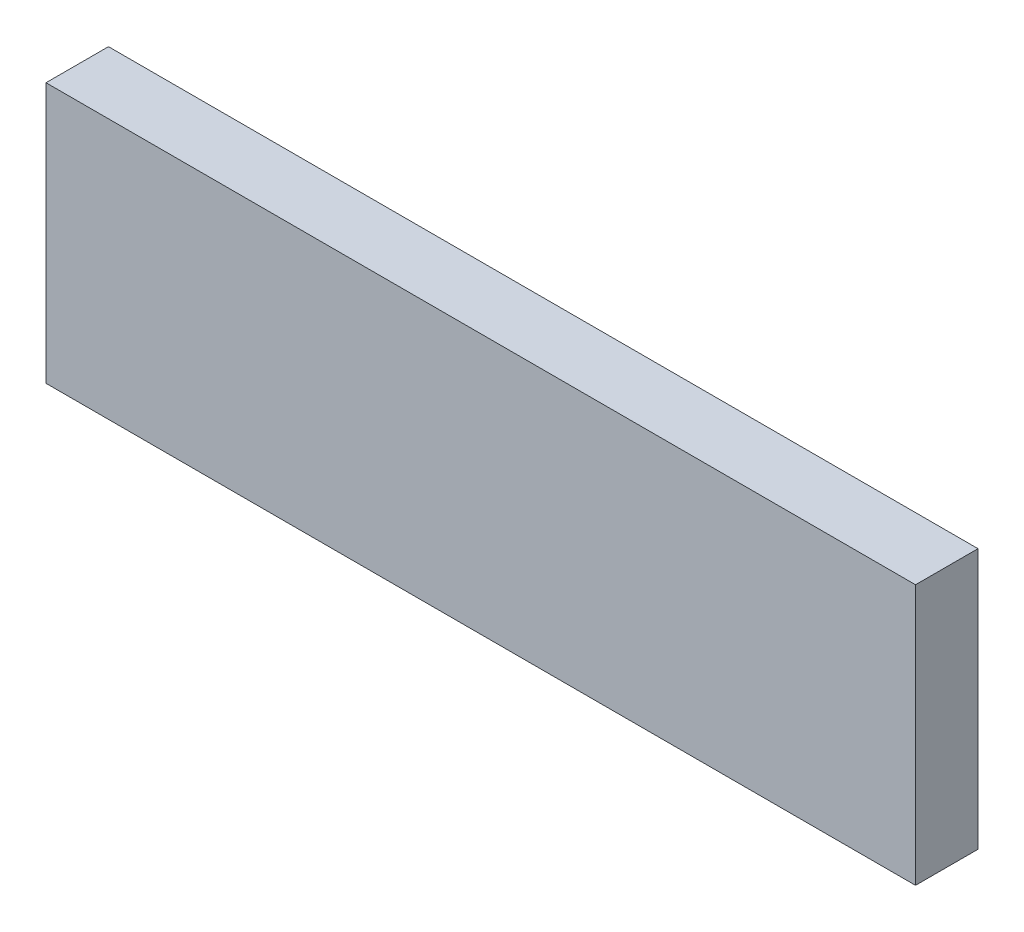
ISO-10303-21;
HEADER;
FILE_DESCRIPTION(('STEP AP214'),'2;1');
FILE_NAME('part.step','',(''),(''),'','','');
FILE_SCHEMA(('AUTOMOTIVE_DESIGN { 1 0 10303 214 1 1 1 1 }'));
ENDSEC;
DATA;
#1=APPLICATION_CONTEXT('core data for automotive mechanical design processes');
#2=APPLICATION_PROTOCOL_DEFINITION('international standard','automotive_design',2000,#1);
#3=PRODUCT_CONTEXT('',#1,'mechanical');
#4=PRODUCT('Part','Part','',(#3));
#5=PRODUCT_RELATED_PRODUCT_CATEGORY('part','',(#4));
#6=PRODUCT_DEFINITION_FORMATION('','',#4);
#7=PRODUCT_DEFINITION_CONTEXT('part definition',#1,'design');
#8=PRODUCT_DEFINITION('design','',#6,#7);
#9=PRODUCT_DEFINITION_SHAPE('','',#8);
#10=(LENGTH_UNIT() NAMED_UNIT(*) SI_UNIT(.MILLI.,.METRE.));
#11=(NAMED_UNIT(*) PLANE_ANGLE_UNIT() SI_UNIT($,.RADIAN.));
#12=(NAMED_UNIT(*) SI_UNIT($,.STERADIAN.) SOLID_ANGLE_UNIT());
#13=UNCERTAINTY_MEASURE_WITH_UNIT(LENGTH_MEASURE(1.E-05),#10,'distance_accuracy_value','');
#14=(GEOMETRIC_REPRESENTATION_CONTEXT(3) GLOBAL_UNCERTAINTY_ASSIGNED_CONTEXT((#13)) GLOBAL_UNIT_ASSIGNED_CONTEXT((#10,
#11,#12)) REPRESENTATION_CONTEXT('',''));
#15=CARTESIAN_POINT('',(0.,0.,0.));
#16=DIRECTION('',(0.,0.,1.));
#17=DIRECTION('',(1.,0.,0.));
#18=AXIS2_PLACEMENT_3D('',#15,#16,#17);
#19=CARTESIAN_POINT('',(83.5,25.,6.));
#20=DIRECTION('',(-1.,0.,0.));
#21=DIRECTION('',(0.,0.,1.));
#22=AXIS2_PLACEMENT_3D('',#19,#20,#21);
#23=PLANE('',#22);
#24=DIRECTION('',(0.,1.,0.));
#25=VECTOR('',#24,1.);
#26=CARTESIAN_POINT('',(83.5,25.,-6.));
#27=LINE('',#26,#25);
#28=CARTESIAN_POINT('',(83.5,-25.,-6.));
#29=VERTEX_POINT('',#28);
#30=CARTESIAN_POINT('',(83.5,25.,-6.));
#31=VERTEX_POINT('',#30);
#32=EDGE_CURVE('E101',#29,#31,#27,.T.);
#33=ORIENTED_EDGE('',*,*,#32,.T.);
#34=DIRECTION('',(0.,0.,-1.));
#35=VECTOR('',#34,1.);
#36=CARTESIAN_POINT('',(83.5,25.,6.));
#37=LINE('',#36,#35);
#38=CARTESIAN_POINT('',(83.5,25.,6.));
#39=VERTEX_POINT('',#38);
#40=EDGE_CURVE('E11',#39,#31,#37,.T.);
#41=ORIENTED_EDGE('',*,*,#40,.F.);
#42=DIRECTION('',(0.,1.,0.));
#43=VECTOR('',#42,1.);
#44=CARTESIAN_POINT('',(83.5,25.,6.));
#45=LINE('',#44,#43);
#46=CARTESIAN_POINT('',(83.5,-25.,6.));
#47=VERTEX_POINT('',#46);
#48=EDGE_CURVE('E88',#47,#39,#45,.T.);
#49=ORIENTED_EDGE('',*,*,#48,.F.);
#50=DIRECTION('',(0.,0.,-1.));
#51=VECTOR('',#50,1.);
#52=CARTESIAN_POINT('',(83.5,-25.,6.));
#53=LINE('',#52,#51);
#54=EDGE_CURVE('E97',#47,#29,#53,.T.);
#55=ORIENTED_EDGE('',*,*,#54,.T.);
#56=EDGE_LOOP('',(#33,#41,#49,#55));
#57=FACE_BOUND('',#56,.T.);
#58=ADVANCED_FACE('F35',(#57),#23,.F.);
#59=CARTESIAN_POINT('',(-83.5,25.,6.));
#60=DIRECTION('',(0.,-1.,0.));
#61=DIRECTION('',(0.,0.,-1.));
#62=AXIS2_PLACEMENT_3D('',#59,#60,#61);
#63=PLANE('',#62);
#64=DIRECTION('',(-1.,0.,0.));
#65=VECTOR('',#64,1.);
#66=CARTESIAN_POINT('',(-83.5,25.,-6.));
#67=LINE('',#66,#65);
#68=CARTESIAN_POINT('',(-83.5,25.,-6.));
#69=VERTEX_POINT('',#68);
#70=EDGE_CURVE('E92',#31,#69,#67,.T.);
#71=ORIENTED_EDGE('',*,*,#70,.T.);
#72=DIRECTION('',(0.,0.,-1.));
#73=VECTOR('',#72,1.);
#74=CARTESIAN_POINT('',(-83.5,25.,6.));
#75=LINE('',#74,#73);
#76=CARTESIAN_POINT('',(-83.5,25.,6.));
#77=VERTEX_POINT('',#76);
#78=EDGE_CURVE('E44',#77,#69,#75,.T.);
#79=ORIENTED_EDGE('',*,*,#78,.F.);
#80=DIRECTION('',(-1.,0.,0.));
#81=VECTOR('',#80,1.);
#82=CARTESIAN_POINT('',(-83.5,25.,6.));
#83=LINE('',#82,#81);
#84=EDGE_CURVE('E83',#39,#77,#83,.T.);
#85=ORIENTED_EDGE('',*,*,#84,.F.);
#86=ORIENTED_EDGE('',*,*,#40,.T.);
#87=EDGE_LOOP('',(#71,#79,#85,#86));
#88=FACE_BOUND('',#87,.T.);
#89=ADVANCED_FACE('F91',(#88),#63,.F.);
#90=CARTESIAN_POINT('',(-83.5,25.,6.));
#91=DIRECTION('',(1.,0.,0.));
#92=DIRECTION('',(0.,0.,-1.));
#93=AXIS2_PLACEMENT_3D('',#90,#91,#92);
#94=PLANE('',#93);
#95=DIRECTION('',(0.,-1.,0.));
#96=VECTOR('',#95,1.);
#97=CARTESIAN_POINT('',(-83.5,25.,-6.));
#98=LINE('',#97,#96);
#99=CARTESIAN_POINT('',(-83.5,-25.,-6.));
#100=VERTEX_POINT('',#99);
#101=EDGE_CURVE('E70',#69,#100,#98,.T.);
#102=ORIENTED_EDGE('',*,*,#101,.T.);
#103=DIRECTION('',(0.,0.,-1.));
#104=VECTOR('',#103,1.);
#105=CARTESIAN_POINT('',(-83.5,-25.,6.));
#106=LINE('',#105,#104);
#107=CARTESIAN_POINT('',(-83.5,-25.,6.));
#108=VERTEX_POINT('',#107);
#109=EDGE_CURVE('E93',#108,#100,#106,.T.);
#110=ORIENTED_EDGE('',*,*,#109,.F.);
#111=DIRECTION('',(0.,-1.,0.));
#112=VECTOR('',#111,1.);
#113=CARTESIAN_POINT('',(-83.5,25.,6.));
#114=LINE('',#113,#112);
#115=EDGE_CURVE('E86',#77,#108,#114,.T.);
#116=ORIENTED_EDGE('',*,*,#115,.F.);
#117=ORIENTED_EDGE('',*,*,#78,.T.);
#118=EDGE_LOOP('',(#102,#110,#116,#117));
#119=FACE_BOUND('',#118,.T.);
#120=ADVANCED_FACE('F95',(#119),#94,.F.);
#121=CARTESIAN_POINT('',(-83.5,-25.,6.));
#122=DIRECTION('',(0.,1.,0.));
#123=DIRECTION('',(0.,0.,1.));
#124=AXIS2_PLACEMENT_3D('',#121,#122,#123);
#125=PLANE('',#124);
#126=CARTESIAN_POINT('',(77.5,-25.,0.));
#127=DIRECTION('',(0.,1.,0.));
#128=DIRECTION('',(0.,0.,1.));
#129=AXIS2_PLACEMENT_3D('',#126,#127,#128);
#130=CIRCLE('',#129,1.5);
#131=CARTESIAN_POINT('',(77.5,-25.,1.5));
#132=VERTEX_POINT('',#131);
#133=EDGE_CURVE('E38',#132,#132,#130,.T.);
#134=ORIENTED_EDGE('',*,*,#133,.T.);
#135=EDGE_LOOP('',(#134));
#136=FACE_BOUND('',#135,.T.);
#137=CARTESIAN_POINT('',(-77.5,-25.,0.));
#138=DIRECTION('',(0.,1.,0.));
#139=DIRECTION('',(0.,0.,1.));
#140=AXIS2_PLACEMENT_3D('',#137,#138,#139);
#141=CIRCLE('',#140,1.5);
#142=CARTESIAN_POINT('',(-77.5,-25.,1.5));
#143=VERTEX_POINT('',#142);
#144=EDGE_CURVE('E104',#143,#143,#141,.T.);
#145=ORIENTED_EDGE('',*,*,#144,.T.);
#146=EDGE_LOOP('',(#145));
#147=FACE_BOUND('',#146,.T.);
#148=DIRECTION('',(1.,0.,0.));
#149=VECTOR('',#148,1.);
#150=CARTESIAN_POINT('',(-83.5,-25.,-6.));
#151=LINE('',#150,#149);
#152=EDGE_CURVE('E76',#100,#29,#151,.T.);
#153=ORIENTED_EDGE('',*,*,#152,.T.);
#154=ORIENTED_EDGE('',*,*,#54,.F.);
#155=DIRECTION('',(1.,0.,0.));
#156=VECTOR('',#155,1.);
#157=CARTESIAN_POINT('',(-83.5,-25.,6.));
#158=LINE('',#157,#156);
#159=EDGE_CURVE('E53',#108,#47,#158,.T.);
#160=ORIENTED_EDGE('',*,*,#159,.F.);
#161=ORIENTED_EDGE('',*,*,#109,.T.);
#162=EDGE_LOOP('',(#153,#154,#160,#161));
#163=FACE_BOUND('',#162,.T.);
#164=ADVANCED_FACE('F132',(#136,#147,#163),#125,.F.);
#165=CARTESIAN_POINT('',(0.,0.,6.));
#166=DIRECTION('',(0.,0.,1.));
#167=DIRECTION('',(1.,0.,0.));
#168=AXIS2_PLACEMENT_3D('',#165,#166,#167);
#169=PLANE('',#168);
#170=ORIENTED_EDGE('',*,*,#48,.T.);
#171=ORIENTED_EDGE('',*,*,#84,.T.);
#172=ORIENTED_EDGE('',*,*,#115,.T.);
#173=ORIENTED_EDGE('',*,*,#159,.T.);
#174=EDGE_LOOP('',(#170,#171,#172,#173));
#175=FACE_BOUND('',#174,.T.);
#176=ADVANCED_FACE('F84',(#175),#169,.T.);
#177=CARTESIAN_POINT('',(0.,0.,-6.));
#178=DIRECTION('',(0.,0.,1.));
#179=DIRECTION('',(1.,0.,0.));
#180=AXIS2_PLACEMENT_3D('',#177,#178,#179);
#181=PLANE('',#180);
#182=ORIENTED_EDGE('',*,*,#32,.F.);
#183=ORIENTED_EDGE('',*,*,#152,.F.);
#184=ORIENTED_EDGE('',*,*,#101,.F.);
#185=ORIENTED_EDGE('',*,*,#70,.F.);
#186=EDGE_LOOP('',(#182,#183,#184,#185));
#187=FACE_BOUND('',#186,.T.);
#188=ADVANCED_FACE('F139',(#187),#181,.F.);
#189=CARTESIAN_POINT('',(-77.5,-10.,0.));
#190=DIRECTION('',(0.,-1.,0.));
#191=DIRECTION('',(0.,0.,-1.));
#192=AXIS2_PLACEMENT_3D('',#189,#190,#191);
#193=CYLINDRICAL_SURFACE('',#192,1.5);
#194=CARTESIAN_POINT('',(-77.5,-10.,0.));
#195=DIRECTION('',(0.,-1.,0.));
#196=DIRECTION('',(0.,0.,-1.));
#197=AXIS2_PLACEMENT_3D('',#194,#195,#196);
#198=CIRCLE('',#197,1.5);
#199=CARTESIAN_POINT('',(-77.5,-10.,-1.5));
#200=VERTEX_POINT('',#199);
#201=EDGE_CURVE('E110',#200,#200,#198,.T.);
#202=ORIENTED_EDGE('',*,*,#201,.F.);
#203=EDGE_LOOP('',(#202));
#204=FACE_BOUND('',#203,.T.);
#205=ORIENTED_EDGE('',*,*,#144,.F.);
#206=EDGE_LOOP('',(#205));
#207=FACE_BOUND('',#206,.T.);
#208=ADVANCED_FACE('F151',(#204,#207),#193,.F.);
#209=CARTESIAN_POINT('',(-77.5,-10.,0.));
#210=DIRECTION('',(0.,-1.,0.));
#211=DIRECTION('',(0.,0.,-1.));
#212=AXIS2_PLACEMENT_3D('',#209,#210,#211);
#213=PLANE('',#212);
#214=ORIENTED_EDGE('',*,*,#201,.T.);
#215=EDGE_LOOP('',(#214));
#216=FACE_BOUND('',#215,.T.);
#217=ADVANCED_FACE('F128',(#216),#213,.T.);
#218=CARTESIAN_POINT('',(77.5,-10.,0.));
#219=DIRECTION('',(0.,-1.,0.));
#220=DIRECTION('',(0.,0.,-1.));
#221=AXIS2_PLACEMENT_3D('',#218,#219,#220);
#222=CYLINDRICAL_SURFACE('',#221,1.5);
#223=CARTESIAN_POINT('',(77.5,-10.,0.));
#224=DIRECTION('',(0.,-1.,0.));
#225=DIRECTION('',(0.,0.,-1.));
#226=AXIS2_PLACEMENT_3D('',#223,#224,#225);
#227=CIRCLE('',#226,1.5);
#228=CARTESIAN_POINT('',(77.5,-10.,-1.5));
#229=VERTEX_POINT('',#228);
#230=EDGE_CURVE('E118',#229,#229,#227,.T.);
#231=ORIENTED_EDGE('',*,*,#230,.F.);
#232=EDGE_LOOP('',(#231));
#233=FACE_BOUND('',#232,.T.);
#234=ORIENTED_EDGE('',*,*,#133,.F.);
#235=EDGE_LOOP('',(#234));
#236=FACE_BOUND('',#235,.T.);
#237=ADVANCED_FACE('F125',(#233,#236),#222,.F.);
#238=CARTESIAN_POINT('',(77.5,-10.,0.));
#239=DIRECTION('',(0.,-1.,0.));
#240=DIRECTION('',(0.,0.,-1.));
#241=AXIS2_PLACEMENT_3D('',#238,#239,#240);
#242=PLANE('',#241);
#243=ORIENTED_EDGE('',*,*,#230,.T.);
#244=EDGE_LOOP('',(#243));
#245=FACE_BOUND('',#244,.T.);
#246=ADVANCED_FACE('F123',(#245),#242,.T.);
#247=CLOSED_SHELL('',(#58,#89,#120,#164,#176,#188,#208,#217,#237,#246));
#248=MANIFOLD_SOLID_BREP('B2',#247);
#249=ADVANCED_BREP_SHAPE_REPRESENTATION('',(#18,#248),#14);
#250=SHAPE_DEFINITION_REPRESENTATION(#9,#249);
ENDSEC;
END-ISO-10303-21;
